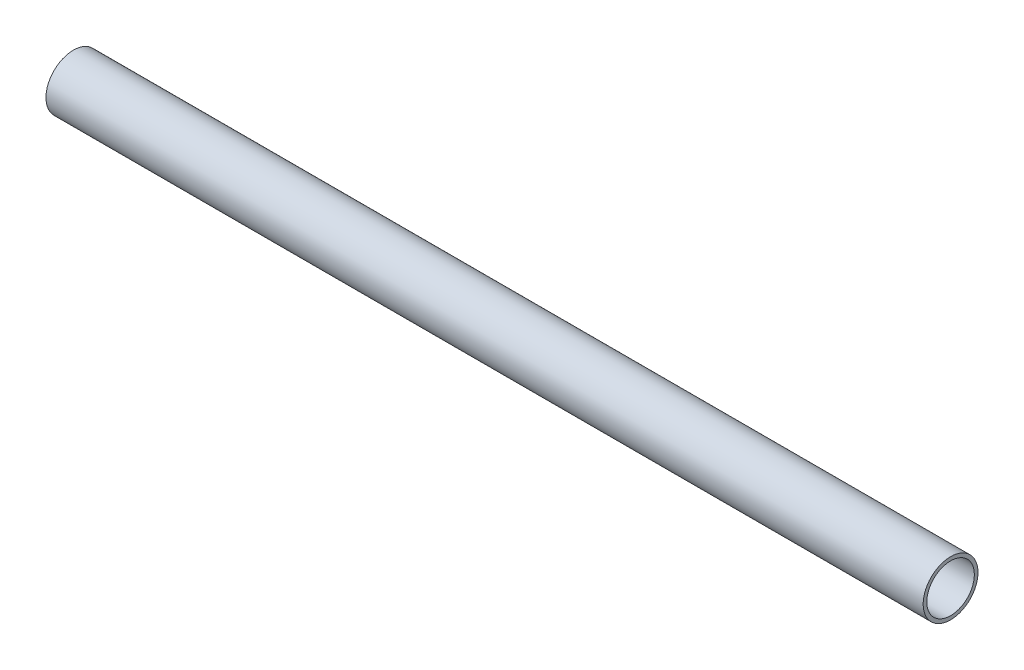
ISO-10303-21;
HEADER;
FILE_DESCRIPTION(('STEP AP214'),'2;1');
FILE_NAME('part.step','',(''),(''),'','','');
FILE_SCHEMA(('AUTOMOTIVE_DESIGN { 1 0 10303 214 1 1 1 1 }'));
ENDSEC;
DATA;
#1=APPLICATION_CONTEXT('core data for automotive mechanical design processes');
#2=APPLICATION_PROTOCOL_DEFINITION('international standard','automotive_design',2000,#1);
#3=PRODUCT_CONTEXT('',#1,'mechanical');
#4=PRODUCT('Part','Part','',(#3));
#5=PRODUCT_RELATED_PRODUCT_CATEGORY('part','',(#4));
#6=PRODUCT_DEFINITION_FORMATION('','',#4);
#7=PRODUCT_DEFINITION_CONTEXT('part definition',#1,'design');
#8=PRODUCT_DEFINITION('design','',#6,#7);
#9=PRODUCT_DEFINITION_SHAPE('','',#8);
#10=(LENGTH_UNIT() NAMED_UNIT(*) SI_UNIT(.MILLI.,.METRE.));
#11=(NAMED_UNIT(*) PLANE_ANGLE_UNIT() SI_UNIT($,.RADIAN.));
#12=(NAMED_UNIT(*) SI_UNIT($,.STERADIAN.) SOLID_ANGLE_UNIT());
#13=UNCERTAINTY_MEASURE_WITH_UNIT(LENGTH_MEASURE(1.E-05),#10,'distance_accuracy_value','');
#14=(GEOMETRIC_REPRESENTATION_CONTEXT(3) GLOBAL_UNCERTAINTY_ASSIGNED_CONTEXT((#13)) GLOBAL_UNIT_ASSIGNED_CONTEXT((#10,
#11,#12)) REPRESENTATION_CONTEXT('',''));
#15=CARTESIAN_POINT('',(0.,0.,0.));
#16=DIRECTION('',(0.,0.,1.));
#17=DIRECTION('',(1.,0.,0.));
#18=AXIS2_PLACEMENT_3D('',#15,#16,#17);
#19=CARTESIAN_POINT('',(240.,0.,0.));
#20=DIRECTION('',(1.,0.,0.));
#21=DIRECTION('',(0.,0.,-1.));
#22=AXIS2_PLACEMENT_3D('',#19,#20,#21);
#23=PLANE('',#22);
#24=CARTESIAN_POINT('',(240.,0.,0.));
#25=DIRECTION('',(1.,0.,0.));
#26=DIRECTION('',(0.,0.,-1.));
#27=AXIS2_PLACEMENT_3D('',#24,#25,#26);
#28=CIRCLE('',#27,7.5);
#29=CARTESIAN_POINT('',(240.,0.,-7.5));
#30=VERTEX_POINT('',#29);
#31=EDGE_CURVE('E10',#30,#30,#28,.T.);
#32=ORIENTED_EDGE('',*,*,#31,.T.);
#33=EDGE_LOOP('',(#32));
#34=FACE_BOUND('',#33,.T.);
#35=CARTESIAN_POINT('',(240.,0.,0.));
#36=DIRECTION('',(1.,0.,0.));
#37=DIRECTION('',(0.,0.,-1.));
#38=AXIS2_PLACEMENT_3D('',#35,#36,#37);
#39=CIRCLE('',#38,6.5);
#40=CARTESIAN_POINT('',(240.,0.,-6.5));
#41=VERTEX_POINT('',#40);
#42=EDGE_CURVE('E42',#41,#41,#39,.T.);
#43=ORIENTED_EDGE('',*,*,#42,.F.);
#44=EDGE_LOOP('',(#43));
#45=FACE_BOUND('',#44,.T.);
#46=ADVANCED_FACE('F31',(#34,#45),#23,.T.);
#47=CARTESIAN_POINT('',(0.,0.,0.));
#48=DIRECTION('',(1.,0.,0.));
#49=DIRECTION('',(0.,0.,-1.));
#50=AXIS2_PLACEMENT_3D('',#47,#48,#49);
#51=PLANE('',#50);
#52=CARTESIAN_POINT('',(0.,0.,0.));
#53=DIRECTION('',(1.,0.,0.));
#54=DIRECTION('',(0.,0.,-1.));
#55=AXIS2_PLACEMENT_3D('',#52,#53,#54);
#56=CIRCLE('',#55,7.5);
#57=CARTESIAN_POINT('',(0.,0.,-7.5));
#58=VERTEX_POINT('',#57);
#59=EDGE_CURVE('E35',#58,#58,#56,.T.);
#60=ORIENTED_EDGE('',*,*,#59,.F.);
#61=EDGE_LOOP('',(#60));
#62=FACE_BOUND('',#61,.T.);
#63=CARTESIAN_POINT('',(0.,0.,0.));
#64=DIRECTION('',(1.,0.,0.));
#65=DIRECTION('',(0.,0.,-1.));
#66=AXIS2_PLACEMENT_3D('',#63,#64,#65);
#67=CIRCLE('',#66,6.5);
#68=CARTESIAN_POINT('',(0.,0.,-6.5));
#69=VERTEX_POINT('',#68);
#70=EDGE_CURVE('E44',#69,#69,#67,.T.);
#71=ORIENTED_EDGE('',*,*,#70,.T.);
#72=EDGE_LOOP('',(#71));
#73=FACE_BOUND('',#72,.T.);
#74=ADVANCED_FACE('F54',(#62,#73),#51,.F.);
#75=CARTESIAN_POINT('',(240.,0.,0.));
#76=DIRECTION('',(-1.,0.,0.));
#77=DIRECTION('',(0.,0.,1.));
#78=AXIS2_PLACEMENT_3D('',#75,#76,#77);
#79=CYLINDRICAL_SURFACE('',#78,7.5);
#80=ORIENTED_EDGE('',*,*,#31,.F.);
#81=EDGE_LOOP('',(#80));
#82=FACE_BOUND('',#81,.T.);
#83=ORIENTED_EDGE('',*,*,#59,.T.);
#84=EDGE_LOOP('',(#83));
#85=FACE_BOUND('',#84,.T.);
#86=ADVANCED_FACE('F33',(#82,#85),#79,.T.);
#87=CARTESIAN_POINT('',(240.,0.,0.));
#88=DIRECTION('',(-1.,0.,0.));
#89=DIRECTION('',(0.,0.,1.));
#90=AXIS2_PLACEMENT_3D('',#87,#88,#89);
#91=CYLINDRICAL_SURFACE('',#90,6.5);
#92=ORIENTED_EDGE('',*,*,#42,.T.);
#93=EDGE_LOOP('',(#92));
#94=FACE_BOUND('',#93,.T.);
#95=ORIENTED_EDGE('',*,*,#70,.F.);
#96=EDGE_LOOP('',(#95));
#97=FACE_BOUND('',#96,.T.);
#98=ADVANCED_FACE('F50',(#94,#97),#91,.F.);
#99=CLOSED_SHELL('',(#46,#74,#86,#98));
#100=MANIFOLD_SOLID_BREP('B2',#99);
#101=ADVANCED_BREP_SHAPE_REPRESENTATION('',(#18,#100),#14);
#102=SHAPE_DEFINITION_REPRESENTATION(#9,#101);
ENDSEC;
END-ISO-10303-21;
